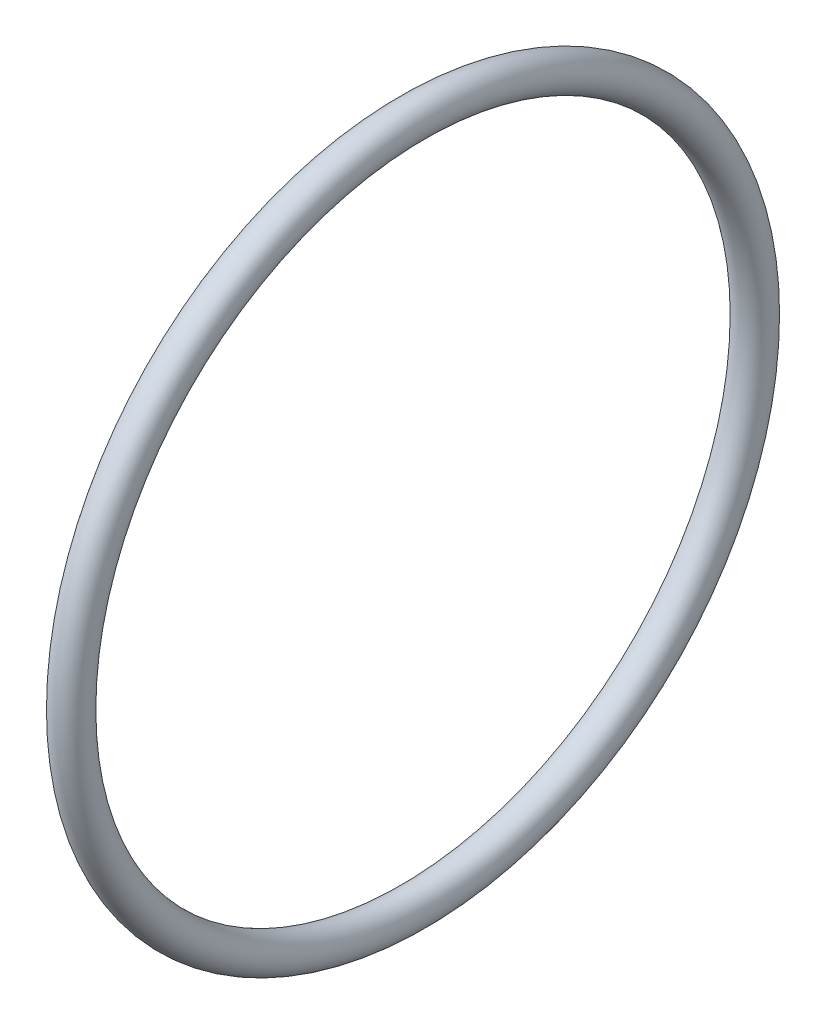
ISO-10303-21;
HEADER;
FILE_DESCRIPTION(('STEP AP214'),'2;1');
FILE_NAME('part.step','',(''),(''),'','','');
FILE_SCHEMA(('AUTOMOTIVE_DESIGN { 1 0 10303 214 1 1 1 1 }'));
ENDSEC;
DATA;
#1=APPLICATION_CONTEXT('core data for automotive mechanical design processes');
#2=APPLICATION_PROTOCOL_DEFINITION('international standard','automotive_design',2000,#1);
#3=PRODUCT_CONTEXT('',#1,'mechanical');
#4=PRODUCT('Part','Part','',(#3));
#5=PRODUCT_RELATED_PRODUCT_CATEGORY('part','',(#4));
#6=PRODUCT_DEFINITION_FORMATION('','',#4);
#7=PRODUCT_DEFINITION_CONTEXT('part definition',#1,'design');
#8=PRODUCT_DEFINITION('design','',#6,#7);
#9=PRODUCT_DEFINITION_SHAPE('','',#8);
#10=(LENGTH_UNIT() NAMED_UNIT(*) SI_UNIT(.MILLI.,.METRE.));
#11=(NAMED_UNIT(*) PLANE_ANGLE_UNIT() SI_UNIT($,.RADIAN.));
#12=(NAMED_UNIT(*) SI_UNIT($,.STERADIAN.) SOLID_ANGLE_UNIT());
#13=UNCERTAINTY_MEASURE_WITH_UNIT(LENGTH_MEASURE(1.E-05),#10,'distance_accuracy_value','');
#14=(GEOMETRIC_REPRESENTATION_CONTEXT(3) GLOBAL_UNCERTAINTY_ASSIGNED_CONTEXT((#13)) GLOBAL_UNIT_ASSIGNED_CONTEXT((#10,
#11,#12)) REPRESENTATION_CONTEXT('',''));
#15=CARTESIAN_POINT('',(0.,0.,0.));
#16=DIRECTION('',(0.,0.,1.));
#17=DIRECTION('',(1.,0.,0.));
#18=AXIS2_PLACEMENT_3D('',#15,#16,#17);
#19=CARTESIAN_POINT('',(0.,0.,0.));
#20=DIRECTION('',(1.,0.,0.));
#21=DIRECTION('',(0.,0.,-1.));
#22=AXIS2_PLACEMENT_3D('',#19,#20,#21);
#23=TOROIDAL_SURFACE('',#22,17.125,0.875);
#24=CARTESIAN_POINT('',(0.,0.,-18.));
#25=VERTEX_POINT('',#24);
#26=VERTEX_LOOP('',#25);
#27=FACE_BOUND('',#26,.T.);
#28=ADVANCED_FACE('F34',(#27),#23,.T.);
#29=CLOSED_SHELL('',(#28));
#30=MANIFOLD_SOLID_BREP('B2',#29);
#31=ADVANCED_BREP_SHAPE_REPRESENTATION('',(#18,#30),#14);
#32=SHAPE_DEFINITION_REPRESENTATION(#9,#31);
ENDSEC;
END-ISO-10303-21;
